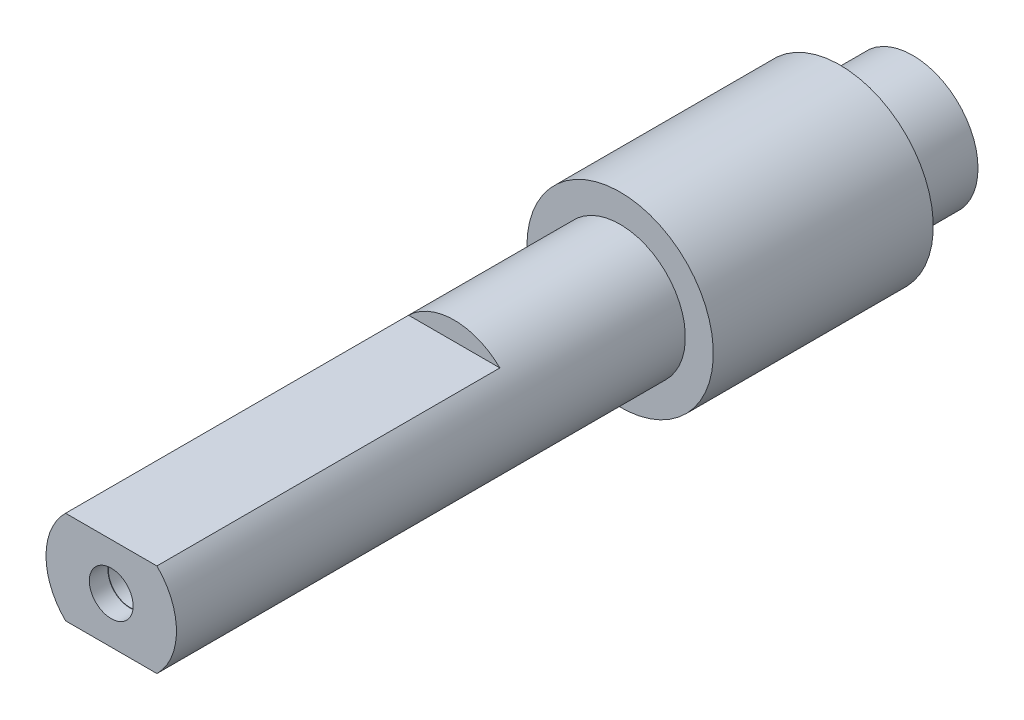
ISO-10303-21;
HEADER;
FILE_DESCRIPTION(('STEP AP214'),'2;1');
FILE_NAME('part.step','',(''),(''),'','','');
FILE_SCHEMA(('AUTOMOTIVE_DESIGN { 1 0 10303 214 1 1 1 1 }'));
ENDSEC;
DATA;
#1=APPLICATION_CONTEXT('core data for automotive mechanical design processes');
#2=APPLICATION_PROTOCOL_DEFINITION('international standard','automotive_design',2000,#1);
#3=PRODUCT_CONTEXT('',#1,'mechanical');
#4=PRODUCT('Part','Part','',(#3));
#5=PRODUCT_RELATED_PRODUCT_CATEGORY('part','',(#4));
#6=PRODUCT_DEFINITION_FORMATION('','',#4);
#7=PRODUCT_DEFINITION_CONTEXT('part definition',#1,'design');
#8=PRODUCT_DEFINITION('design','',#6,#7);
#9=PRODUCT_DEFINITION_SHAPE('','',#8);
#10=(LENGTH_UNIT() NAMED_UNIT(*) SI_UNIT(.MILLI.,.METRE.));
#11=(NAMED_UNIT(*) PLANE_ANGLE_UNIT() SI_UNIT($,.RADIAN.));
#12=(NAMED_UNIT(*) SI_UNIT($,.STERADIAN.) SOLID_ANGLE_UNIT());
#13=UNCERTAINTY_MEASURE_WITH_UNIT(LENGTH_MEASURE(1.E-05),#10,'distance_accuracy_value','');
#14=(GEOMETRIC_REPRESENTATION_CONTEXT(3) GLOBAL_UNCERTAINTY_ASSIGNED_CONTEXT((#13)) GLOBAL_UNIT_ASSIGNED_CONTEXT((#10,
#11,#12)) REPRESENTATION_CONTEXT('',''));
#15=CARTESIAN_POINT('',(0.,0.,0.));
#16=DIRECTION('',(0.,0.,1.));
#17=DIRECTION('',(1.,0.,0.));
#18=AXIS2_PLACEMENT_3D('',#15,#16,#17);
#19=CARTESIAN_POINT('',(0.,0.,43.));
#20=DIRECTION('',(0.,0.,-1.));
#21=DIRECTION('',(-1.,0.,0.));
#22=AXIS2_PLACEMENT_3D('',#19,#20,#21);
#23=CYLINDRICAL_SURFACE('',#22,3.5);
#24=DIRECTION('',(0.,0.,-1.));
#25=VECTOR('',#24,1.);
#26=CARTESIAN_POINT('',(-2.44948974278318,-2.5,43.));
#27=LINE('',#26,#25);
#28=CARTESIAN_POINT('',(-2.44948974278318,-2.5,43.));
#29=VERTEX_POINT('',#28);
#30=CARTESIAN_POINT('',(-2.44948974278318,-2.5,24.6));
#31=VERTEX_POINT('',#30);
#32=EDGE_CURVE('E102',#29,#31,#27,.T.);
#33=ORIENTED_EDGE('',*,*,#32,.F.);
#34=CARTESIAN_POINT('',(0.,0.,43.));
#35=DIRECTION('',(0.,0.,1.));
#36=DIRECTION('',(1.,0.,0.));
#37=AXIS2_PLACEMENT_3D('',#34,#35,#36);
#38=CIRCLE('',#37,3.5);
#39=CARTESIAN_POINT('',(-2.44948974278318,2.5,43.));
#40=VERTEX_POINT('',#39);
#41=EDGE_CURVE('E88',#40,#29,#38,.T.);
#42=ORIENTED_EDGE('',*,*,#41,.F.);
#43=DIRECTION('',(0.,0.,-1.));
#44=VECTOR('',#43,1.);
#45=CARTESIAN_POINT('',(-2.44948974278318,2.5,43.));
#46=LINE('',#45,#44);
#47=CARTESIAN_POINT('',(-2.44948974278318,2.5,24.6));
#48=VERTEX_POINT('',#47);
#49=EDGE_CURVE('E61',#48,#40,#46,.F.);
#50=ORIENTED_EDGE('',*,*,#49,.F.);
#51=CARTESIAN_POINT('',(0.,0.,24.6));
#52=DIRECTION('',(0.,0.,1.));
#53=DIRECTION('',(1.,0.,0.));
#54=AXIS2_PLACEMENT_3D('',#51,#52,#53);
#55=CIRCLE('',#54,3.5);
#56=CARTESIAN_POINT('',(2.44948974278318,2.5,24.6));
#57=VERTEX_POINT('',#56);
#58=EDGE_CURVE('E96',#57,#48,#55,.T.);
#59=ORIENTED_EDGE('',*,*,#58,.F.);
#60=DIRECTION('',(0.,0.,-1.));
#61=VECTOR('',#60,1.);
#62=CARTESIAN_POINT('',(2.44948974278318,2.5,43.));
#63=LINE('',#62,#61);
#64=CARTESIAN_POINT('',(2.44948974278318,2.5,43.));
#65=VERTEX_POINT('',#64);
#66=EDGE_CURVE('E81',#65,#57,#63,.T.);
#67=ORIENTED_EDGE('',*,*,#66,.F.);
#68=CARTESIAN_POINT('',(2.44948974278318,-2.5,43.));
#69=VERTEX_POINT('',#68);
#70=EDGE_CURVE('E95',#69,#65,#38,.T.);
#71=ORIENTED_EDGE('',*,*,#70,.F.);
#72=DIRECTION('',(0.,0.,-1.));
#73=VECTOR('',#72,1.);
#74=CARTESIAN_POINT('',(2.44948974278318,-2.5,43.));
#75=LINE('',#74,#73);
#76=CARTESIAN_POINT('',(2.44948974278318,-2.5,24.6));
#77=VERTEX_POINT('',#76);
#78=EDGE_CURVE('E53',#77,#69,#75,.F.);
#79=ORIENTED_EDGE('',*,*,#78,.F.);
#80=EDGE_CURVE('E46',#31,#77,#55,.T.);
#81=ORIENTED_EDGE('',*,*,#80,.F.);
#82=EDGE_LOOP('',(#33,#42,#50,#59,#67,#71,#79,#81));
#83=FACE_BOUND('',#82,.T.);
#84=CARTESIAN_POINT('',(0.,0.,15.7));
#85=DIRECTION('',(0.,0.,-1.));
#86=DIRECTION('',(-1.,0.,0.));
#87=AXIS2_PLACEMENT_3D('',#84,#85,#86);
#88=CIRCLE('',#87,3.5);
#89=CARTESIAN_POINT('',(-3.5,0.,15.7));
#90=VERTEX_POINT('',#89);
#91=EDGE_CURVE('E12',#90,#90,#88,.T.);
#92=ORIENTED_EDGE('',*,*,#91,.F.);
#93=EDGE_LOOP('',(#92));
#94=FACE_BOUND('',#93,.T.);
#95=ADVANCED_FACE('F38',(#83,#94),#23,.T.);
#96=CARTESIAN_POINT('',(0.,0.,43.));
#97=DIRECTION('',(0.,0.,1.));
#98=DIRECTION('',(1.,0.,0.));
#99=AXIS2_PLACEMENT_3D('',#96,#97,#98);
#100=PLANE('',#99);
#101=CARTESIAN_POINT('',(0.,0.,43.));
#102=DIRECTION('',(0.,0.,1.));
#103=DIRECTION('',(1.,0.,0.));
#104=AXIS2_PLACEMENT_3D('',#101,#102,#103);
#105=CIRCLE('',#104,1.175);
#106=CARTESIAN_POINT('',(1.175,0.,43.));
#107=VERTEX_POINT('',#106);
#108=EDGE_CURVE('E125',#107,#107,#105,.T.);
#109=ORIENTED_EDGE('',*,*,#108,.F.);
#110=EDGE_LOOP('',(#109));
#111=FACE_BOUND('',#110,.T.);
#112=ORIENTED_EDGE('',*,*,#41,.T.);
#113=DIRECTION('',(1.,0.,0.));
#114=VECTOR('',#113,1.);
#115=CARTESIAN_POINT('',(0.,-2.5,43.));
#116=LINE('',#115,#114);
#117=EDGE_CURVE('E87',#29,#69,#116,.T.);
#118=ORIENTED_EDGE('',*,*,#117,.T.);
#119=ORIENTED_EDGE('',*,*,#70,.T.);
#120=DIRECTION('',(-1.,0.,0.));
#121=VECTOR('',#120,1.);
#122=CARTESIAN_POINT('',(0.,2.5,43.));
#123=LINE('',#122,#121);
#124=EDGE_CURVE('E78',#65,#40,#123,.T.);
#125=ORIENTED_EDGE('',*,*,#124,.T.);
#126=EDGE_LOOP('',(#112,#118,#119,#125));
#127=FACE_BOUND('',#126,.T.);
#128=ADVANCED_FACE('F98',(#111,#127),#100,.T.);
#129=CARTESIAN_POINT('',(-5.29689765246846,2.5,24.6));
#130=DIRECTION('',(0.,1.,0.));
#131=DIRECTION('',(0.,0.,1.));
#132=AXIS2_PLACEMENT_3D('',#129,#130,#131);
#133=PLANE('',#132);
#134=ORIENTED_EDGE('',*,*,#66,.T.);
#135=DIRECTION('',(-1.,0.,0.));
#136=VECTOR('',#135,1.);
#137=CARTESIAN_POINT('',(-5.29689765246846,2.5,24.6));
#138=LINE('',#137,#136);
#139=EDGE_CURVE('E110',#57,#48,#138,.T.);
#140=ORIENTED_EDGE('',*,*,#139,.T.);
#141=ORIENTED_EDGE('',*,*,#49,.T.);
#142=ORIENTED_EDGE('',*,*,#124,.F.);
#143=EDGE_LOOP('',(#134,#140,#141,#142));
#144=FACE_BOUND('',#143,.T.);
#145=ADVANCED_FACE('F80',(#144),#133,.T.);
#146=CARTESIAN_POINT('',(0.,0.,24.6));
#147=DIRECTION('',(0.,0.,1.));
#148=DIRECTION('',(1.,0.,0.));
#149=AXIS2_PLACEMENT_3D('',#146,#147,#148);
#150=PLANE('',#149);
#151=ORIENTED_EDGE('',*,*,#58,.T.);
#152=ORIENTED_EDGE('',*,*,#139,.F.);
#153=EDGE_LOOP('',(#151,#152));
#154=FACE_BOUND('',#153,.T.);
#155=ADVANCED_FACE('F135',(#154),#150,.T.);
#156=ORIENTED_EDGE('',*,*,#80,.T.);
#157=DIRECTION('',(1.,0.,0.));
#158=VECTOR('',#157,1.);
#159=CARTESIAN_POINT('',(-5.29689765246846,-2.5,24.6));
#160=LINE('',#159,#158);
#161=EDGE_CURVE('E114',#31,#77,#160,.T.);
#162=ORIENTED_EDGE('',*,*,#161,.F.);
#163=EDGE_LOOP('',(#156,#162));
#164=FACE_BOUND('',#163,.T.);
#165=ADVANCED_FACE('F133',(#164),#150,.T.);
#166=CARTESIAN_POINT('',(-5.29689765246846,-2.5,24.6));
#167=DIRECTION('',(0.,-1.,0.));
#168=DIRECTION('',(0.,0.,-1.));
#169=AXIS2_PLACEMENT_3D('',#166,#167,#168);
#170=PLANE('',#169);
#171=ORIENTED_EDGE('',*,*,#32,.T.);
#172=ORIENTED_EDGE('',*,*,#161,.T.);
#173=ORIENTED_EDGE('',*,*,#78,.T.);
#174=ORIENTED_EDGE('',*,*,#117,.F.);
#175=EDGE_LOOP('',(#171,#172,#173,#174));
#176=FACE_BOUND('',#175,.T.);
#177=ADVANCED_FACE('F130',(#176),#170,.T.);
#178=CARTESIAN_POINT('',(0.,0.,15.7));
#179=DIRECTION('',(0.,0.,-1.));
#180=DIRECTION('',(-1.,0.,0.));
#181=AXIS2_PLACEMENT_3D('',#178,#179,#180);
#182=CYLINDRICAL_SURFACE('',#181,5.);
#183=CARTESIAN_POINT('',(0.,0.,15.7));
#184=DIRECTION('',(0.,0.,-1.));
#185=DIRECTION('',(-1.,0.,0.));
#186=AXIS2_PLACEMENT_3D('',#183,#184,#185);
#187=CIRCLE('',#186,5.);
#188=CARTESIAN_POINT('',(-5.,0.,15.7));
#189=VERTEX_POINT('',#188);
#190=EDGE_CURVE('E111',#189,#189,#187,.T.);
#191=ORIENTED_EDGE('',*,*,#190,.T.);
#192=EDGE_LOOP('',(#191));
#193=FACE_BOUND('',#192,.T.);
#194=CARTESIAN_POINT('',(0.,0.,3.9));
#195=DIRECTION('',(0.,0.,-1.));
#196=DIRECTION('',(-1.,0.,0.));
#197=AXIS2_PLACEMENT_3D('',#194,#195,#196);
#198=CIRCLE('',#197,5.);
#199=CARTESIAN_POINT('',(-5.,0.,3.9));
#200=VERTEX_POINT('',#199);
#201=EDGE_CURVE('E117',#200,#200,#198,.T.);
#202=ORIENTED_EDGE('',*,*,#201,.F.);
#203=EDGE_LOOP('',(#202));
#204=FACE_BOUND('',#203,.T.);
#205=ADVANCED_FACE('F141',(#193,#204),#182,.T.);
#206=CARTESIAN_POINT('',(0.,0.,15.7));
#207=DIRECTION('',(0.,0.,-1.));
#208=DIRECTION('',(-1.,0.,0.));
#209=AXIS2_PLACEMENT_3D('',#206,#207,#208);
#210=PLANE('',#209);
#211=ORIENTED_EDGE('',*,*,#91,.T.);
#212=EDGE_LOOP('',(#211));
#213=FACE_BOUND('',#212,.T.);
#214=ORIENTED_EDGE('',*,*,#190,.F.);
#215=EDGE_LOOP('',(#214));
#216=FACE_BOUND('',#215,.T.);
#217=ADVANCED_FACE('F168',(#213,#216),#210,.F.);
#218=CARTESIAN_POINT('',(0.,0.,3.9));
#219=DIRECTION('',(0.,0.,-1.));
#220=DIRECTION('',(-1.,0.,0.));
#221=AXIS2_PLACEMENT_3D('',#218,#219,#220);
#222=PLANE('',#221);
#223=CARTESIAN_POINT('',(0.,0.,3.9));
#224=DIRECTION('',(0.,0.,-1.));
#225=DIRECTION('',(-1.,0.,0.));
#226=AXIS2_PLACEMENT_3D('',#223,#224,#225);
#227=CIRCLE('',#226,3.5);
#228=CARTESIAN_POINT('',(-3.5,0.,3.9));
#229=VERTEX_POINT('',#228);
#230=EDGE_CURVE('E108',#229,#229,#227,.T.);
#231=ORIENTED_EDGE('',*,*,#230,.F.);
#232=EDGE_LOOP('',(#231));
#233=FACE_BOUND('',#232,.T.);
#234=ORIENTED_EDGE('',*,*,#201,.T.);
#235=EDGE_LOOP('',(#234));
#236=FACE_BOUND('',#235,.T.);
#237=ADVANCED_FACE('F161',(#233,#236),#222,.T.);
#238=CARTESIAN_POINT('',(0.,0.,0.));
#239=DIRECTION('',(0.,0.,1.));
#240=DIRECTION('',(1.,0.,0.));
#241=AXIS2_PLACEMENT_3D('',#238,#239,#240);
#242=PLANE('',#241);
#243=CARTESIAN_POINT('',(0.,0.,0.));
#244=DIRECTION('',(0.,0.,1.));
#245=DIRECTION('',(1.,0.,0.));
#246=AXIS2_PLACEMENT_3D('',#243,#244,#245);
#247=CIRCLE('',#246,3.5);
#248=CARTESIAN_POINT('',(3.5,0.,0.));
#249=VERTEX_POINT('',#248);
#250=EDGE_CURVE('E99',#249,#249,#247,.T.);
#251=ORIENTED_EDGE('',*,*,#250,.F.);
#252=EDGE_LOOP('',(#251));
#253=FACE_BOUND('',#252,.T.);
#254=ADVANCED_FACE('F153',(#253),#242,.F.);
#255=ORIENTED_EDGE('',*,*,#230,.T.);
#256=EDGE_LOOP('',(#255));
#257=FACE_BOUND('',#256,.T.);
#258=ORIENTED_EDGE('',*,*,#250,.T.);
#259=EDGE_LOOP('',(#258));
#260=FACE_BOUND('',#259,.T.);
#261=ADVANCED_FACE('F40',(#257,#260),#23,.T.);
#262=CARTESIAN_POINT('',(0.,0.,42.));
#263=DIRECTION('',(0.,0.,1.));
#264=DIRECTION('',(1.,0.,0.));
#265=AXIS2_PLACEMENT_3D('',#262,#263,#264);
#266=CYLINDRICAL_SURFACE('',#265,1.175);
#267=CARTESIAN_POINT('',(0.,0.,42.));
#268=DIRECTION('',(0.,0.,1.));
#269=DIRECTION('',(1.,0.,0.));
#270=AXIS2_PLACEMENT_3D('',#267,#268,#269);
#271=CIRCLE('',#270,1.175);
#272=CARTESIAN_POINT('',(1.175,0.,42.));
#273=VERTEX_POINT('',#272);
#274=EDGE_CURVE('E122',#273,#273,#271,.T.);
#275=ORIENTED_EDGE('',*,*,#274,.F.);
#276=EDGE_LOOP('',(#275));
#277=FACE_BOUND('',#276,.T.);
#278=ORIENTED_EDGE('',*,*,#108,.T.);
#279=EDGE_LOOP('',(#278));
#280=FACE_BOUND('',#279,.T.);
#281=ADVANCED_FACE('F152',(#277,#280),#266,.F.);
#282=CARTESIAN_POINT('',(0.,0.,42.));
#283=DIRECTION('',(0.,0.,1.));
#284=DIRECTION('',(1.,0.,0.));
#285=AXIS2_PLACEMENT_3D('',#282,#283,#284);
#286=PLANE('',#285);
#287=CARTESIAN_POINT('',(0.,0.,42.));
#288=DIRECTION('',(0.,0.,1.));
#289=DIRECTION('',(1.,0.,0.));
#290=AXIS2_PLACEMENT_3D('',#287,#288,#289);
#291=CIRCLE('',#290,1.15);
#292=CARTESIAN_POINT('',(1.15,0.,42.));
#293=VERTEX_POINT('',#292);
#294=EDGE_CURVE('E269',#293,#293,#291,.T.);
#295=ORIENTED_EDGE('',*,*,#294,.F.);
#296=EDGE_LOOP('',(#295));
#297=FACE_BOUND('',#296,.T.);
#298=ORIENTED_EDGE('',*,*,#274,.T.);
#299=EDGE_LOOP('',(#298));
#300=FACE_BOUND('',#299,.T.);
#301=ADVANCED_FACE('F158',(#297,#300),#286,.T.);
#302=CARTESIAN_POINT('',(0.,0.,36.));
#303=DIRECTION('',(0.,0.,1.));
#304=DIRECTION('',(1.,0.,0.));
#305=AXIS2_PLACEMENT_3D('',#302,#303,#304);
#306=CYLINDRICAL_SURFACE('',#305,1.15);
#307=CARTESIAN_POINT('',(0.,0.,36.));
#308=DIRECTION('',(0.,0.,1.));
#309=DIRECTION('',(1.,0.,0.));
#310=AXIS2_PLACEMENT_3D('',#307,#308,#309);
#311=CIRCLE('',#310,1.15);
#312=CARTESIAN_POINT('',(1.15,0.,36.));
#313=VERTEX_POINT('',#312);
#314=EDGE_CURVE('E268',#313,#313,#311,.T.);
#315=ORIENTED_EDGE('',*,*,#314,.F.);
#316=EDGE_LOOP('',(#315));
#317=FACE_BOUND('',#316,.T.);
#318=ORIENTED_EDGE('',*,*,#294,.T.);
#319=EDGE_LOOP('',(#318));
#320=FACE_BOUND('',#319,.T.);
#321=ADVANCED_FACE('F242',(#317,#320),#306,.F.);
#322=CARTESIAN_POINT('',(0.,0.,36.));
#323=DIRECTION('',(0.,0.,1.));
#324=DIRECTION('',(1.,0.,0.));
#325=AXIS2_PLACEMENT_3D('',#322,#323,#324);
#326=PLANE('',#325);
#327=ORIENTED_EDGE('',*,*,#314,.T.);
#328=EDGE_LOOP('',(#327));
#329=FACE_BOUND('',#328,.T.);
#330=ADVANCED_FACE('F252',(#329),#326,.T.);
#331=CLOSED_SHELL('',(#95,#128,#145,#155,#165,#177,#205,#217,#237,#254,#261,#281,#301,#321,#330));
#332=MANIFOLD_SOLID_BREP('B2',#331);
#333=ADVANCED_BREP_SHAPE_REPRESENTATION('',(#18,#332),#14);
#334=SHAPE_DEFINITION_REPRESENTATION(#9,#333);
ENDSEC;
END-ISO-10303-21;
